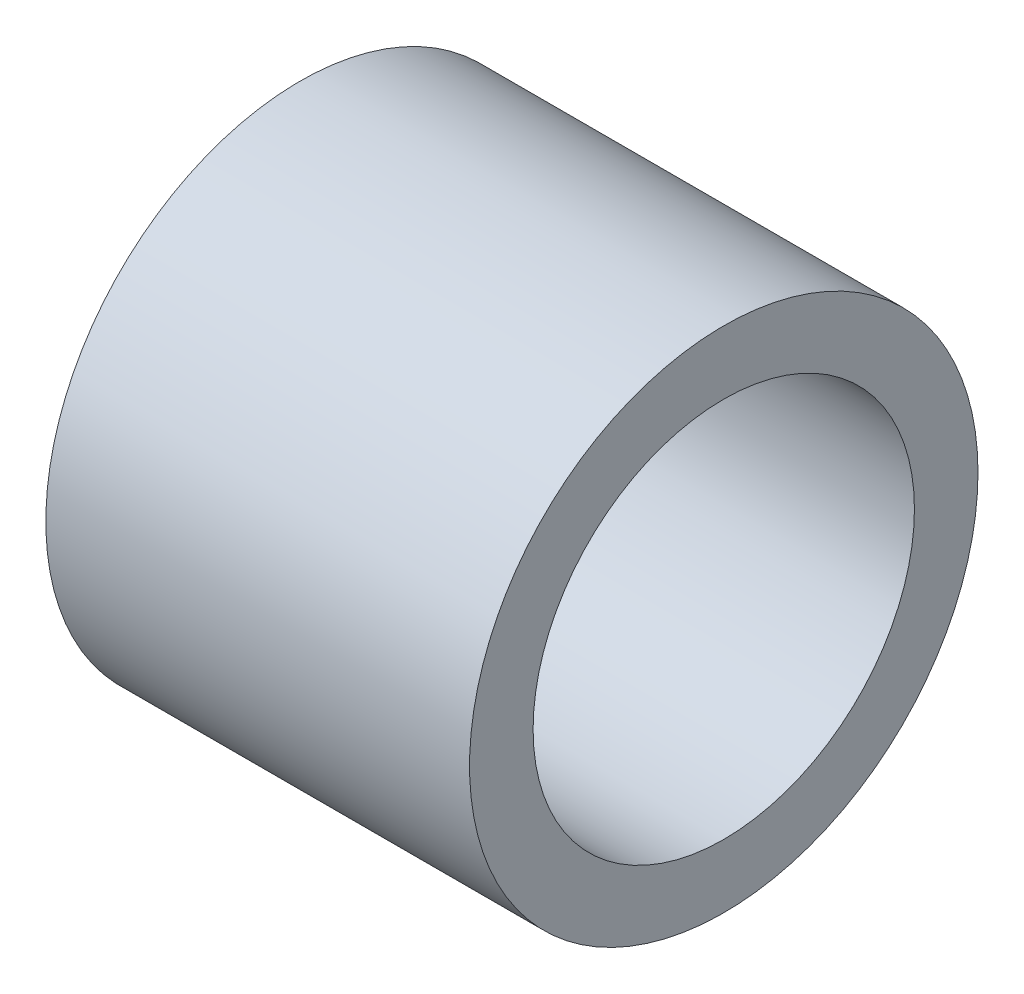
ISO-10303-21;
HEADER;
FILE_DESCRIPTION(('STEP AP214'),'2;1');
FILE_NAME('part.step','',(''),(''),'','','');
FILE_SCHEMA(('AUTOMOTIVE_DESIGN { 1 0 10303 214 1 1 1 1 }'));
ENDSEC;
DATA;
#1=APPLICATION_CONTEXT('core data for automotive mechanical design processes');
#2=APPLICATION_PROTOCOL_DEFINITION('international standard','automotive_design',2000,#1);
#3=PRODUCT_CONTEXT('',#1,'mechanical');
#4=PRODUCT('Part','Part','',(#3));
#5=PRODUCT_RELATED_PRODUCT_CATEGORY('part','',(#4));
#6=PRODUCT_DEFINITION_FORMATION('','',#4);
#7=PRODUCT_DEFINITION_CONTEXT('part definition',#1,'design');
#8=PRODUCT_DEFINITION('design','',#6,#7);
#9=PRODUCT_DEFINITION_SHAPE('','',#8);
#10=(LENGTH_UNIT() NAMED_UNIT(*) SI_UNIT(.MILLI.,.METRE.));
#11=(NAMED_UNIT(*) PLANE_ANGLE_UNIT() SI_UNIT($,.RADIAN.));
#12=(NAMED_UNIT(*) SI_UNIT($,.STERADIAN.) SOLID_ANGLE_UNIT());
#13=UNCERTAINTY_MEASURE_WITH_UNIT(LENGTH_MEASURE(1.E-05),#10,'distance_accuracy_value','');
#14=(GEOMETRIC_REPRESENTATION_CONTEXT(3) GLOBAL_UNCERTAINTY_ASSIGNED_CONTEXT((#13)) GLOBAL_UNIT_ASSIGNED_CONTEXT((#10,
#11,#12)) REPRESENTATION_CONTEXT('',''));
#15=CARTESIAN_POINT('',(0.,0.,0.));
#16=DIRECTION('',(0.,0.,1.));
#17=DIRECTION('',(1.,0.,0.));
#18=AXIS2_PLACEMENT_3D('',#15,#16,#17);
#19=CARTESIAN_POINT('',(2.5,0.,0.));
#20=DIRECTION('',(1.,0.,0.));
#21=DIRECTION('',(0.,0.,-1.));
#22=AXIS2_PLACEMENT_3D('',#19,#20,#21);
#23=PLANE('',#22);
#24=CARTESIAN_POINT('',(2.5,0.,0.));
#25=DIRECTION('',(1.,0.,0.));
#26=DIRECTION('',(0.,0.,-1.));
#27=AXIS2_PLACEMENT_3D('',#24,#25,#26);
#28=CIRCLE('',#27,2.99999999999996);
#29=CARTESIAN_POINT('',(2.5,0.,-3.));
#30=VERTEX_POINT('',#29);
#31=EDGE_CURVE('E11',#30,#30,#28,.T.);
#32=ORIENTED_EDGE('',*,*,#31,.T.);
#33=EDGE_LOOP('',(#32));
#34=FACE_BOUND('',#33,.T.);
#35=CARTESIAN_POINT('',(2.5,0.,0.));
#36=DIRECTION('',(1.,0.,0.));
#37=DIRECTION('',(0.,0.,-1.));
#38=AXIS2_PLACEMENT_3D('',#35,#36,#37);
#39=CIRCLE('',#38,2.25);
#40=CARTESIAN_POINT('',(2.5,0.,-2.25));
#41=VERTEX_POINT('',#40);
#42=EDGE_CURVE('E48',#41,#41,#39,.T.);
#43=ORIENTED_EDGE('',*,*,#42,.F.);
#44=EDGE_LOOP('',(#43));
#45=FACE_BOUND('',#44,.T.);
#46=ADVANCED_FACE('F37',(#34,#45),#23,.T.);
#47=CARTESIAN_POINT('',(-2.5,0.,0.));
#48=DIRECTION('',(1.,0.,0.));
#49=DIRECTION('',(0.,0.,-1.));
#50=AXIS2_PLACEMENT_3D('',#47,#48,#49);
#51=PLANE('',#50);
#52=CARTESIAN_POINT('',(-2.5,0.,0.));
#53=DIRECTION('',(1.,0.,0.));
#54=DIRECTION('',(0.,0.,-1.));
#55=AXIS2_PLACEMENT_3D('',#52,#53,#54);
#56=CIRCLE('',#55,2.99999999999996);
#57=CARTESIAN_POINT('',(-2.5,0.,-3.));
#58=VERTEX_POINT('',#57);
#59=EDGE_CURVE('E41',#58,#58,#56,.T.);
#60=ORIENTED_EDGE('',*,*,#59,.F.);
#61=EDGE_LOOP('',(#60));
#62=FACE_BOUND('',#61,.T.);
#63=CARTESIAN_POINT('',(-2.5,0.,0.));
#64=DIRECTION('',(1.,0.,0.));
#65=DIRECTION('',(0.,0.,-1.));
#66=AXIS2_PLACEMENT_3D('',#63,#64,#65);
#67=CIRCLE('',#66,2.25);
#68=CARTESIAN_POINT('',(-2.5,0.,-2.25));
#69=VERTEX_POINT('',#68);
#70=EDGE_CURVE('E50',#69,#69,#67,.T.);
#71=ORIENTED_EDGE('',*,*,#70,.T.);
#72=EDGE_LOOP('',(#71));
#73=FACE_BOUND('',#72,.T.);
#74=ADVANCED_FACE('F60',(#62,#73),#51,.F.);
#75=CARTESIAN_POINT('',(2.5,0.,0.));
#76=DIRECTION('',(-1.,0.,0.));
#77=DIRECTION('',(0.,0.,1.));
#78=AXIS2_PLACEMENT_3D('',#75,#76,#77);
#79=CYLINDRICAL_SURFACE('',#78,2.99999999999996);
#80=ORIENTED_EDGE('',*,*,#31,.F.);
#81=EDGE_LOOP('',(#80));
#82=FACE_BOUND('',#81,.T.);
#83=ORIENTED_EDGE('',*,*,#59,.T.);
#84=EDGE_LOOP('',(#83));
#85=FACE_BOUND('',#84,.T.);
#86=ADVANCED_FACE('F39',(#82,#85),#79,.T.);
#87=CARTESIAN_POINT('',(2.5,0.,0.));
#88=DIRECTION('',(-1.,0.,0.));
#89=DIRECTION('',(0.,0.,1.));
#90=AXIS2_PLACEMENT_3D('',#87,#88,#89);
#91=CYLINDRICAL_SURFACE('',#90,2.25);
#92=ORIENTED_EDGE('',*,*,#42,.T.);
#93=EDGE_LOOP('',(#92));
#94=FACE_BOUND('',#93,.T.);
#95=ORIENTED_EDGE('',*,*,#70,.F.);
#96=EDGE_LOOP('',(#95));
#97=FACE_BOUND('',#96,.T.);
#98=ADVANCED_FACE('F56',(#94,#97),#91,.F.);
#99=CLOSED_SHELL('',(#46,#74,#86,#98));
#100=MANIFOLD_SOLID_BREP('B2',#99);
#101=ADVANCED_BREP_SHAPE_REPRESENTATION('',(#18,#100),#14);
#102=SHAPE_DEFINITION_REPRESENTATION(#9,#101);
ENDSEC;
END-ISO-10303-21;
